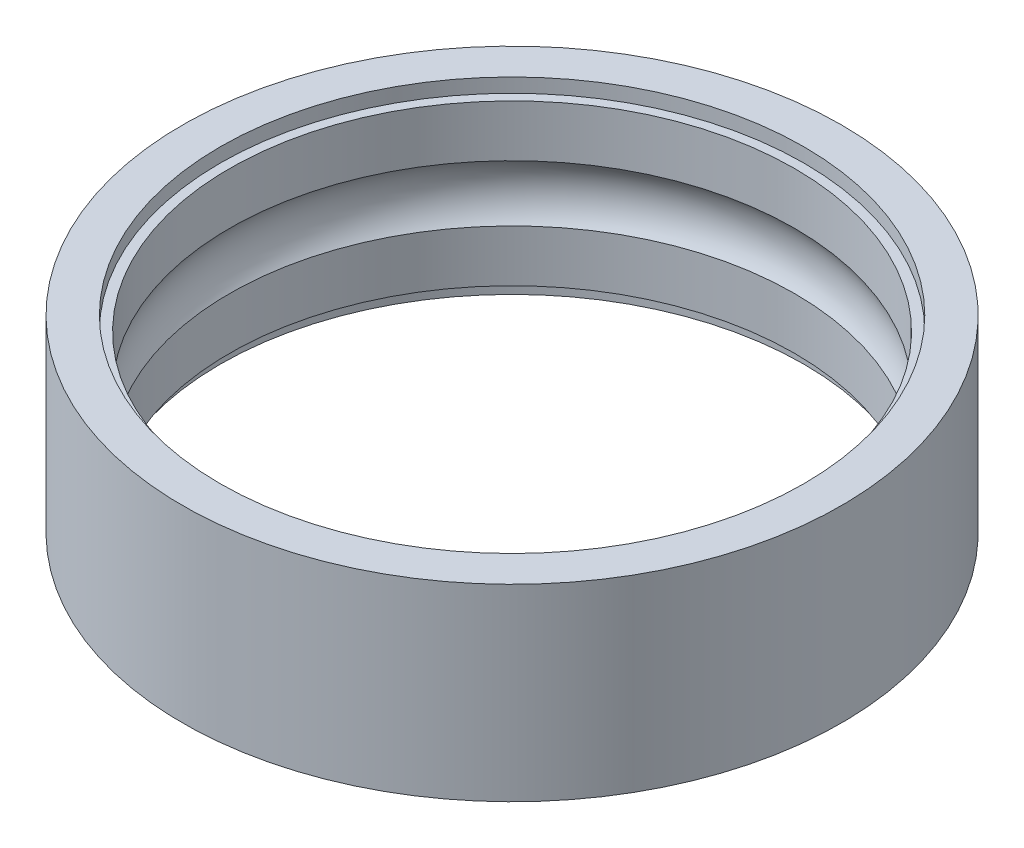
ISO-10303-21;
HEADER;
FILE_DESCRIPTION(('STEP AP214'),'2;1');
FILE_NAME('part.step','',(''),(''),'','','');
FILE_SCHEMA(('AUTOMOTIVE_DESIGN { 1 0 10303 214 1 1 1 1 }'));
ENDSEC;
DATA;
#1=APPLICATION_CONTEXT('core data for automotive mechanical design processes');
#2=APPLICATION_PROTOCOL_DEFINITION('international standard','automotive_design',2000,#1);
#3=PRODUCT_CONTEXT('',#1,'mechanical');
#4=PRODUCT('Part','Part','',(#3));
#5=PRODUCT_RELATED_PRODUCT_CATEGORY('part','',(#4));
#6=PRODUCT_DEFINITION_FORMATION('','',#4);
#7=PRODUCT_DEFINITION_CONTEXT('part definition',#1,'design');
#8=PRODUCT_DEFINITION('design','',#6,#7);
#9=PRODUCT_DEFINITION_SHAPE('','',#8);
#10=(LENGTH_UNIT() NAMED_UNIT(*) SI_UNIT(.MILLI.,.METRE.));
#11=(NAMED_UNIT(*) PLANE_ANGLE_UNIT() SI_UNIT($,.RADIAN.));
#12=(NAMED_UNIT(*) SI_UNIT($,.STERADIAN.) SOLID_ANGLE_UNIT());
#13=UNCERTAINTY_MEASURE_WITH_UNIT(LENGTH_MEASURE(1.E-05),#10,'distance_accuracy_value','');
#14=(GEOMETRIC_REPRESENTATION_CONTEXT(3) GLOBAL_UNCERTAINTY_ASSIGNED_CONTEXT((#13)) GLOBAL_UNIT_ASSIGNED_CONTEXT((#10,
#11,#12)) REPRESENTATION_CONTEXT('',''));
#15=CARTESIAN_POINT('',(0.,0.,0.));
#16=DIRECTION('',(0.,0.,1.));
#17=DIRECTION('',(1.,0.,0.));
#18=AXIS2_PLACEMENT_3D('',#15,#16,#17);
#19=CARTESIAN_POINT('',(0.,0.,0.));
#20=DIRECTION('',(0.,-1.,0.));
#21=DIRECTION('',(0.,0.,-1.));
#22=AXIS2_PLACEMENT_3D('',#19,#20,#21);
#23=CYLINDRICAL_SURFACE('',#22,17.5);
#24=CARTESIAN_POINT('',(0.,5.,0.));
#25=DIRECTION('',(0.,-1.,0.));
#26=DIRECTION('',(0.,0.,-1.));
#27=AXIS2_PLACEMENT_3D('',#24,#25,#26);
#28=CIRCLE('',#27,17.5);
#29=CARTESIAN_POINT('',(0.,5.,-17.5));
#30=VERTEX_POINT('',#29);
#31=EDGE_CURVE('E10',#30,#30,#28,.T.);
#32=ORIENTED_EDGE('',*,*,#31,.T.);
#33=EDGE_LOOP('',(#32));
#34=FACE_BOUND('',#33,.T.);
#35=CARTESIAN_POINT('',(0.,-5.,0.));
#36=DIRECTION('',(0.,-1.,0.));
#37=DIRECTION('',(0.,0.,-1.));
#38=AXIS2_PLACEMENT_3D('',#35,#36,#37);
#39=CIRCLE('',#38,17.5);
#40=CARTESIAN_POINT('',(0.,-5.,-17.5));
#41=VERTEX_POINT('',#40);
#42=EDGE_CURVE('E75',#41,#41,#39,.T.);
#43=ORIENTED_EDGE('',*,*,#42,.F.);
#44=EDGE_LOOP('',(#43));
#45=FACE_BOUND('',#44,.T.);
#46=ADVANCED_FACE('F41',(#34,#45),#23,.T.);
#47=CARTESIAN_POINT('',(15.4962385582732,5.,0.));
#48=DIRECTION('',(0.,1.,0.));
#49=DIRECTION('',(0.,0.,1.));
#50=AXIS2_PLACEMENT_3D('',#47,#48,#49);
#51=PLANE('',#50);
#52=CARTESIAN_POINT('',(0.,5.,0.));
#53=DIRECTION('',(0.,-1.,0.));
#54=DIRECTION('',(0.,0.,-1.));
#55=AXIS2_PLACEMENT_3D('',#52,#53,#54);
#56=CIRCLE('',#55,15.4962385582732);
#57=CARTESIAN_POINT('',(0.,5.,-15.4962385582732));
#58=VERTEX_POINT('',#57);
#59=EDGE_CURVE('E47',#58,#58,#56,.T.);
#60=ORIENTED_EDGE('',*,*,#59,.T.);
#61=EDGE_LOOP('',(#60));
#62=FACE_BOUND('',#61,.T.);
#63=ORIENTED_EDGE('',*,*,#31,.F.);
#64=EDGE_LOOP('',(#63));
#65=FACE_BOUND('',#64,.T.);
#66=ADVANCED_FACE('F83',(#62,#65),#51,.T.);
#67=CARTESIAN_POINT('',(0.,0.,0.));
#68=DIRECTION('',(0.,-1.,0.));
#69=DIRECTION('',(0.,0.,-1.));
#70=AXIS2_PLACEMENT_3D('',#67,#68,#69);
#71=CYLINDRICAL_SURFACE('',#70,15.4962385582732);
#72=CARTESIAN_POINT('',(0.,4.25,0.));
#73=DIRECTION('',(0.,-1.,0.));
#74=DIRECTION('',(0.,0.,-1.));
#75=AXIS2_PLACEMENT_3D('',#72,#73,#74);
#76=CIRCLE('',#75,15.4962385582732);
#77=CARTESIAN_POINT('',(0.,4.25,-15.4962385582732));
#78=VERTEX_POINT('',#77);
#79=EDGE_CURVE('E51',#78,#78,#76,.T.);
#80=ORIENTED_EDGE('',*,*,#79,.T.);
#81=EDGE_LOOP('',(#80));
#82=FACE_BOUND('',#81,.T.);
#83=ORIENTED_EDGE('',*,*,#59,.F.);
#84=EDGE_LOOP('',(#83));
#85=FACE_BOUND('',#84,.T.);
#86=ADVANCED_FACE('F87',(#82,#85),#71,.F.);
#87=CARTESIAN_POINT('',(15.,4.25,0.));
#88=DIRECTION('',(0.,1.,0.));
#89=DIRECTION('',(0.,0.,1.));
#90=AXIS2_PLACEMENT_3D('',#87,#88,#89);
#91=PLANE('',#90);
#92=CARTESIAN_POINT('',(0.,4.25,0.));
#93=DIRECTION('',(0.,-1.,0.));
#94=DIRECTION('',(0.,0.,-1.));
#95=AXIS2_PLACEMENT_3D('',#92,#93,#94);
#96=CIRCLE('',#95,15.);
#97=CARTESIAN_POINT('',(0.,4.25,-15.));
#98=VERTEX_POINT('',#97);
#99=EDGE_CURVE('E55',#98,#98,#96,.T.);
#100=ORIENTED_EDGE('',*,*,#99,.T.);
#101=EDGE_LOOP('',(#100));
#102=FACE_BOUND('',#101,.T.);
#103=ORIENTED_EDGE('',*,*,#79,.F.);
#104=EDGE_LOOP('',(#103));
#105=FACE_BOUND('',#104,.T.);
#106=ADVANCED_FACE('F91',(#102,#105),#91,.T.);
#107=CARTESIAN_POINT('',(0.,0.,0.));
#108=DIRECTION('',(0.,-1.,0.));
#109=DIRECTION('',(0.,0.,-1.));
#110=AXIS2_PLACEMENT_3D('',#107,#108,#109);
#111=CYLINDRICAL_SURFACE('',#110,15.);
#112=CARTESIAN_POINT('',(0.,1.5,0.));
#113=DIRECTION('',(0.,-1.,0.));
#114=DIRECTION('',(0.,0.,-1.));
#115=AXIS2_PLACEMENT_3D('',#112,#113,#114);
#116=CIRCLE('',#115,15.);
#117=CARTESIAN_POINT('',(0.,1.5,-15.));
#118=VERTEX_POINT('',#117);
#119=EDGE_CURVE('E60',#118,#118,#116,.T.);
#120=ORIENTED_EDGE('',*,*,#119,.T.);
#121=EDGE_LOOP('',(#120));
#122=FACE_BOUND('',#121,.T.);
#123=ORIENTED_EDGE('',*,*,#99,.F.);
#124=EDGE_LOOP('',(#123));
#125=FACE_BOUND('',#124,.T.);
#126=ADVANCED_FACE('F98',(#122,#125),#111,.F.);
#127=CARTESIAN_POINT('',(0.,0.,0.));
#128=DIRECTION('',(0.,-1.,0.));
#129=DIRECTION('',(0.,0.,-1.));
#130=AXIS2_PLACEMENT_3D('',#127,#128,#129);
#131=TOROIDAL_SURFACE('',#130,13.,2.5);
#132=CARTESIAN_POINT('',(0.,-1.5,0.));
#133=DIRECTION('',(0.,-1.,0.));
#134=DIRECTION('',(0.,0.,-1.));
#135=AXIS2_PLACEMENT_3D('',#132,#133,#134);
#136=CIRCLE('',#135,15.);
#137=CARTESIAN_POINT('',(0.,-1.5,-15.));
#138=VERTEX_POINT('',#137);
#139=EDGE_CURVE('E63',#138,#138,#136,.T.);
#140=ORIENTED_EDGE('',*,*,#139,.T.);
#141=EDGE_LOOP('',(#140));
#142=FACE_BOUND('',#141,.T.);
#143=ORIENTED_EDGE('',*,*,#119,.F.);
#144=EDGE_LOOP('',(#143));
#145=FACE_BOUND('',#144,.T.);
#146=ADVANCED_FACE('F102',(#142,#145),#131,.F.);
#147=CARTESIAN_POINT('',(0.,0.,0.));
#148=DIRECTION('',(0.,-1.,0.));
#149=DIRECTION('',(0.,0.,-1.));
#150=AXIS2_PLACEMENT_3D('',#147,#148,#149);
#151=CYLINDRICAL_SURFACE('',#150,15.);
#152=CARTESIAN_POINT('',(0.,-4.25,0.));
#153=DIRECTION('',(0.,-1.,0.));
#154=DIRECTION('',(0.,0.,-1.));
#155=AXIS2_PLACEMENT_3D('',#152,#153,#154);
#156=CIRCLE('',#155,15.);
#157=CARTESIAN_POINT('',(0.,-4.25,-15.));
#158=VERTEX_POINT('',#157);
#159=EDGE_CURVE('E66',#158,#158,#156,.T.);
#160=ORIENTED_EDGE('',*,*,#159,.T.);
#161=EDGE_LOOP('',(#160));
#162=FACE_BOUND('',#161,.T.);
#163=ORIENTED_EDGE('',*,*,#139,.F.);
#164=EDGE_LOOP('',(#163));
#165=FACE_BOUND('',#164,.T.);
#166=ADVANCED_FACE('F106',(#162,#165),#151,.F.);
#167=CARTESIAN_POINT('',(15.,-4.25,0.));
#168=DIRECTION('',(0.,-1.,0.));
#169=DIRECTION('',(0.,0.,-1.));
#170=AXIS2_PLACEMENT_3D('',#167,#168,#169);
#171=PLANE('',#170);
#172=CARTESIAN_POINT('',(0.,-4.25,0.));
#173=DIRECTION('',(0.,-1.,0.));
#174=DIRECTION('',(0.,0.,-1.));
#175=AXIS2_PLACEMENT_3D('',#172,#173,#174);
#176=CIRCLE('',#175,15.4962385582732);
#177=CARTESIAN_POINT('',(0.,-4.25,-15.4962385582732));
#178=VERTEX_POINT('',#177);
#179=EDGE_CURVE('E69',#178,#178,#176,.T.);
#180=ORIENTED_EDGE('',*,*,#179,.T.);
#181=EDGE_LOOP('',(#180));
#182=FACE_BOUND('',#181,.T.);
#183=ORIENTED_EDGE('',*,*,#159,.F.);
#184=EDGE_LOOP('',(#183));
#185=FACE_BOUND('',#184,.T.);
#186=ADVANCED_FACE('F110',(#182,#185),#171,.T.);
#187=CARTESIAN_POINT('',(0.,0.,0.));
#188=DIRECTION('',(0.,-1.,0.));
#189=DIRECTION('',(0.,0.,-1.));
#190=AXIS2_PLACEMENT_3D('',#187,#188,#189);
#191=CYLINDRICAL_SURFACE('',#190,15.4962385582732);
#192=CARTESIAN_POINT('',(0.,-5.,0.));
#193=DIRECTION('',(0.,-1.,0.));
#194=DIRECTION('',(0.,0.,-1.));
#195=AXIS2_PLACEMENT_3D('',#192,#193,#194);
#196=CIRCLE('',#195,15.4962385582732);
#197=CARTESIAN_POINT('',(0.,-5.,-15.4962385582732));
#198=VERTEX_POINT('',#197);
#199=EDGE_CURVE('E72',#198,#198,#196,.T.);
#200=ORIENTED_EDGE('',*,*,#199,.T.);
#201=EDGE_LOOP('',(#200));
#202=FACE_BOUND('',#201,.T.);
#203=ORIENTED_EDGE('',*,*,#179,.F.);
#204=EDGE_LOOP('',(#203));
#205=FACE_BOUND('',#204,.T.);
#206=ADVANCED_FACE('F114',(#202,#205),#191,.F.);
#207=CARTESIAN_POINT('',(15.4962385582732,-5.,0.));
#208=DIRECTION('',(0.,-1.,0.));
#209=DIRECTION('',(0.,0.,-1.));
#210=AXIS2_PLACEMENT_3D('',#207,#208,#209);
#211=PLANE('',#210);
#212=ORIENTED_EDGE('',*,*,#42,.T.);
#213=EDGE_LOOP('',(#212));
#214=FACE_BOUND('',#213,.T.);
#215=ORIENTED_EDGE('',*,*,#199,.F.);
#216=EDGE_LOOP('',(#215));
#217=FACE_BOUND('',#216,.T.);
#218=ADVANCED_FACE('F79',(#214,#217),#211,.T.);
#219=CLOSED_SHELL('',(#46,#66,#86,#106,#126,#146,#166,#186,#206,#218));
#220=MANIFOLD_SOLID_BREP('B2',#219);
#221=ADVANCED_BREP_SHAPE_REPRESENTATION('',(#18,#220),#14);
#222=SHAPE_DEFINITION_REPRESENTATION(#9,#221);
ENDSEC;
END-ISO-10303-21;
